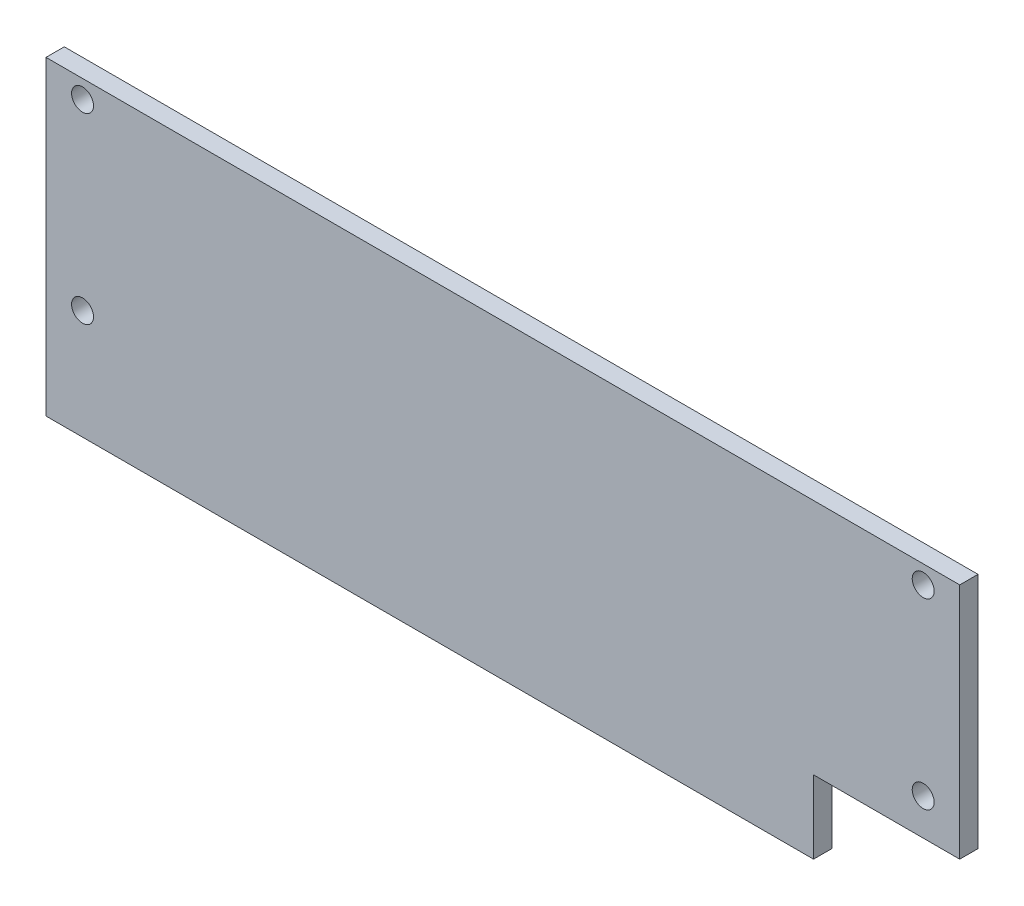
ISO-10303-21;
HEADER;
FILE_DESCRIPTION(('STEP AP214'),'2;1');
FILE_NAME('part.step','',(''),(''),'','','');
FILE_SCHEMA(('AUTOMOTIVE_DESIGN { 1 0 10303 214 1 1 1 1 }'));
ENDSEC;
DATA;
#1=APPLICATION_CONTEXT('core data for automotive mechanical design processes');
#2=APPLICATION_PROTOCOL_DEFINITION('international standard','automotive_design',2000,#1);
#3=PRODUCT_CONTEXT('',#1,'mechanical');
#4=PRODUCT('Part','Part','',(#3));
#5=PRODUCT_RELATED_PRODUCT_CATEGORY('part','',(#4));
#6=PRODUCT_DEFINITION_FORMATION('','',#4);
#7=PRODUCT_DEFINITION_CONTEXT('part definition',#1,'design');
#8=PRODUCT_DEFINITION('design','',#6,#7);
#9=PRODUCT_DEFINITION_SHAPE('','',#8);
#10=(LENGTH_UNIT() NAMED_UNIT(*) SI_UNIT(.MILLI.,.METRE.));
#11=(NAMED_UNIT(*) PLANE_ANGLE_UNIT() SI_UNIT($,.RADIAN.));
#12=(NAMED_UNIT(*) SI_UNIT($,.STERADIAN.) SOLID_ANGLE_UNIT());
#13=UNCERTAINTY_MEASURE_WITH_UNIT(LENGTH_MEASURE(1.E-05),#10,'distance_accuracy_value','');
#14=(GEOMETRIC_REPRESENTATION_CONTEXT(3) GLOBAL_UNCERTAINTY_ASSIGNED_CONTEXT((#13)) GLOBAL_UNIT_ASSIGNED_CONTEXT((#10,
#11,#12)) REPRESENTATION_CONTEXT('',''));
#15=CARTESIAN_POINT('',(0.,0.,0.));
#16=DIRECTION('',(0.,0.,1.));
#17=DIRECTION('',(1.,0.,0.));
#18=AXIS2_PLACEMENT_3D('',#15,#16,#17);
#19=CARTESIAN_POINT('',(0.,0.,5.));
#20=DIRECTION('',(0.,0.,1.));
#21=DIRECTION('',(1.,0.,0.));
#22=AXIS2_PLACEMENT_3D('',#19,#20,#21);
#23=PLANE('',#22);
#24=DIRECTION('',(-1.,0.,0.));
#25=VECTOR('',#24,1.);
#26=CARTESIAN_POINT('',(0.,-65.,5.));
#27=LINE('',#26,#25);
#28=CARTESIAN_POINT('',(250.,-65.,5.));
#29=VERTEX_POINT('',#28);
#30=CARTESIAN_POINT('',(210.,-65.,5.));
#31=VERTEX_POINT('',#30);
#32=EDGE_CURVE('E143',#29,#31,#27,.T.);
#33=ORIENTED_EDGE('',*,*,#32,.F.);
#34=DIRECTION('',(0.,1.,0.));
#35=VECTOR('',#34,1.);
#36=CARTESIAN_POINT('',(250.,0.,5.));
#37=LINE('',#36,#35);
#38=CARTESIAN_POINT('',(250.,0.,5.));
#39=VERTEX_POINT('',#38);
#40=EDGE_CURVE('E135',#29,#39,#37,.T.);
#41=ORIENTED_EDGE('',*,*,#40,.T.);
#42=DIRECTION('',(-1.,0.,0.));
#43=VECTOR('',#42,1.);
#44=CARTESIAN_POINT('',(0.,0.,5.));
#45=LINE('',#44,#43);
#46=CARTESIAN_POINT('',(0.,0.,5.));
#47=VERTEX_POINT('',#46);
#48=EDGE_CURVE('E56',#39,#47,#45,.T.);
#49=ORIENTED_EDGE('',*,*,#48,.T.);
#50=DIRECTION('',(0.,-1.,0.));
#51=VECTOR('',#50,1.);
#52=CARTESIAN_POINT('',(0.,0.,5.));
#53=LINE('',#52,#51);
#54=CARTESIAN_POINT('',(0.,-85.,5.));
#55=VERTEX_POINT('',#54);
#56=EDGE_CURVE('E124',#47,#55,#53,.T.);
#57=ORIENTED_EDGE('',*,*,#56,.T.);
#58=DIRECTION('',(1.,0.,0.));
#59=VECTOR('',#58,1.);
#60=CARTESIAN_POINT('',(0.,-85.,5.));
#61=LINE('',#60,#59);
#62=CARTESIAN_POINT('',(210.,-85.,5.));
#63=VERTEX_POINT('',#62);
#64=EDGE_CURVE('E80',#55,#63,#61,.T.);
#65=ORIENTED_EDGE('',*,*,#64,.T.);
#66=DIRECTION('',(0.,-1.,0.));
#67=VECTOR('',#66,1.);
#68=CARTESIAN_POINT('',(210.,0.,5.));
#69=LINE('',#68,#67);
#70=EDGE_CURVE('E101',#31,#63,#69,.T.);
#71=ORIENTED_EDGE('',*,*,#70,.F.);
#72=EDGE_LOOP('',(#33,#41,#49,#57,#65,#71));
#73=FACE_BOUND('',#72,.T.);
#74=CARTESIAN_POINT('',(240.,-55.,5.));
#75=DIRECTION('',(0.,0.,1.));
#76=DIRECTION('',(-1.,0.,0.));
#77=AXIS2_PLACEMENT_3D('',#74,#75,#76);
#78=CIRCLE('',#77,2.99999999999999);
#79=CARTESIAN_POINT('',(237.,-55.,5.));
#80=VERTEX_POINT('',#79);
#81=EDGE_CURVE('E157',#80,#80,#78,.T.);
#82=ORIENTED_EDGE('',*,*,#81,.F.);
#83=EDGE_LOOP('',(#82));
#84=FACE_BOUND('',#83,.T.);
#85=CARTESIAN_POINT('',(10.,-5.,5.));
#86=DIRECTION('',(0.,0.,1.));
#87=DIRECTION('',(1.,0.,0.));
#88=AXIS2_PLACEMENT_3D('',#85,#86,#87);
#89=CIRCLE('',#88,3.);
#90=CARTESIAN_POINT('',(13.,-5.,5.));
#91=VERTEX_POINT('',#90);
#92=EDGE_CURVE('E119',#91,#91,#89,.T.);
#93=ORIENTED_EDGE('',*,*,#92,.F.);
#94=EDGE_LOOP('',(#93));
#95=FACE_BOUND('',#94,.T.);
#96=CARTESIAN_POINT('',(10.,-55.,5.));
#97=DIRECTION('',(0.,0.,1.));
#98=DIRECTION('',(1.,0.,0.));
#99=AXIS2_PLACEMENT_3D('',#96,#97,#98);
#100=CIRCLE('',#99,3.);
#101=CARTESIAN_POINT('',(13.,-55.,5.));
#102=VERTEX_POINT('',#101);
#103=EDGE_CURVE('E163',#102,#102,#100,.T.);
#104=ORIENTED_EDGE('',*,*,#103,.F.);
#105=EDGE_LOOP('',(#104));
#106=FACE_BOUND('',#105,.T.);
#107=CARTESIAN_POINT('',(240.,-5.,5.));
#108=DIRECTION('',(0.,0.,1.));
#109=DIRECTION('',(-1.,0.,0.));
#110=AXIS2_PLACEMENT_3D('',#107,#108,#109);
#111=CIRCLE('',#110,3.00000000000002);
#112=CARTESIAN_POINT('',(237.,-5.,5.));
#113=VERTEX_POINT('',#112);
#114=EDGE_CURVE('E151',#113,#113,#111,.T.);
#115=ORIENTED_EDGE('',*,*,#114,.F.);
#116=EDGE_LOOP('',(#115));
#117=FACE_BOUND('',#116,.T.);
#118=ADVANCED_FACE('F33',(#73,#84,#95,#106,#117),#23,.T.);
#119=CARTESIAN_POINT('',(0.,0.,0.));
#120=DIRECTION('',(0.,0.,1.));
#121=DIRECTION('',(1.,0.,0.));
#122=AXIS2_PLACEMENT_3D('',#119,#120,#121);
#123=PLANE('',#122);
#124=DIRECTION('',(0.,1.,0.));
#125=VECTOR('',#124,1.);
#126=CARTESIAN_POINT('',(250.,0.,0.));
#127=LINE('',#126,#125);
#128=CARTESIAN_POINT('',(250.,-65.,0.));
#129=VERTEX_POINT('',#128);
#130=CARTESIAN_POINT('',(250.,0.,0.));
#131=VERTEX_POINT('',#130);
#132=EDGE_CURVE('E115',#129,#131,#127,.T.);
#133=ORIENTED_EDGE('',*,*,#132,.F.);
#134=DIRECTION('',(1.,0.,0.));
#135=VECTOR('',#134,1.);
#136=CARTESIAN_POINT('',(210.,-65.,0.));
#137=LINE('',#136,#135);
#138=CARTESIAN_POINT('',(210.,-65.,0.));
#139=VERTEX_POINT('',#138);
#140=EDGE_CURVE('E48',#139,#129,#137,.T.);
#141=ORIENTED_EDGE('',*,*,#140,.F.);
#142=DIRECTION('',(0.,1.,0.));
#143=VECTOR('',#142,1.);
#144=CARTESIAN_POINT('',(210.,-85.,0.));
#145=LINE('',#144,#143);
#146=CARTESIAN_POINT('',(210.,-85.,0.));
#147=VERTEX_POINT('',#146);
#148=EDGE_CURVE('E99',#147,#139,#145,.T.);
#149=ORIENTED_EDGE('',*,*,#148,.F.);
#150=DIRECTION('',(1.,0.,0.));
#151=VECTOR('',#150,1.);
#152=CARTESIAN_POINT('',(0.,-85.,0.));
#153=LINE('',#152,#151);
#154=CARTESIAN_POINT('',(0.,-85.,0.));
#155=VERTEX_POINT('',#154);
#156=EDGE_CURVE('E110',#155,#147,#153,.T.);
#157=ORIENTED_EDGE('',*,*,#156,.F.);
#158=DIRECTION('',(0.,-1.,0.));
#159=VECTOR('',#158,1.);
#160=CARTESIAN_POINT('',(0.,0.,0.));
#161=LINE('',#160,#159);
#162=CARTESIAN_POINT('',(0.,0.,0.));
#163=VERTEX_POINT('',#162);
#164=EDGE_CURVE('E116',#163,#155,#161,.T.);
#165=ORIENTED_EDGE('',*,*,#164,.F.);
#166=DIRECTION('',(-1.,0.,0.));
#167=VECTOR('',#166,1.);
#168=CARTESIAN_POINT('',(0.,0.,0.));
#169=LINE('',#168,#167);
#170=EDGE_CURVE('E73',#131,#163,#169,.T.);
#171=ORIENTED_EDGE('',*,*,#170,.F.);
#172=EDGE_LOOP('',(#133,#141,#149,#157,#165,#171));
#173=FACE_BOUND('',#172,.T.);
#174=CARTESIAN_POINT('',(10.,-5.,0.));
#175=DIRECTION('',(0.,0.,1.));
#176=DIRECTION('',(1.,0.,0.));
#177=AXIS2_PLACEMENT_3D('',#174,#175,#176);
#178=CIRCLE('',#177,3.);
#179=CARTESIAN_POINT('',(13.,-5.,0.));
#180=VERTEX_POINT('',#179);
#181=EDGE_CURVE('E138',#180,#180,#178,.T.);
#182=ORIENTED_EDGE('',*,*,#181,.T.);
#183=EDGE_LOOP('',(#182));
#184=FACE_BOUND('',#183,.T.);
#185=CARTESIAN_POINT('',(10.,-55.,0.));
#186=DIRECTION('',(0.,0.,1.));
#187=DIRECTION('',(1.,0.,0.));
#188=AXIS2_PLACEMENT_3D('',#185,#186,#187);
#189=CIRCLE('',#188,3.);
#190=CARTESIAN_POINT('',(13.,-55.,0.));
#191=VERTEX_POINT('',#190);
#192=EDGE_CURVE('E160',#191,#191,#189,.T.);
#193=ORIENTED_EDGE('',*,*,#192,.T.);
#194=EDGE_LOOP('',(#193));
#195=FACE_BOUND('',#194,.T.);
#196=CARTESIAN_POINT('',(240.,-55.,0.));
#197=DIRECTION('',(0.,0.,1.));
#198=DIRECTION('',(-1.,0.,0.));
#199=AXIS2_PLACEMENT_3D('',#196,#197,#198);
#200=CIRCLE('',#199,2.99999999999999);
#201=CARTESIAN_POINT('',(237.,-55.,0.));
#202=VERTEX_POINT('',#201);
#203=EDGE_CURVE('E155',#202,#202,#200,.T.);
#204=ORIENTED_EDGE('',*,*,#203,.T.);
#205=EDGE_LOOP('',(#204));
#206=FACE_BOUND('',#205,.T.);
#207=CARTESIAN_POINT('',(240.,-5.,0.));
#208=DIRECTION('',(0.,0.,1.));
#209=DIRECTION('',(-1.,0.,0.));
#210=AXIS2_PLACEMENT_3D('',#207,#208,#209);
#211=CIRCLE('',#210,3.00000000000002);
#212=CARTESIAN_POINT('',(237.,-5.,0.));
#213=VERTEX_POINT('',#212);
#214=EDGE_CURVE('E148',#213,#213,#211,.T.);
#215=ORIENTED_EDGE('',*,*,#214,.T.);
#216=EDGE_LOOP('',(#215));
#217=FACE_BOUND('',#216,.T.);
#218=ADVANCED_FACE('F107',(#173,#184,#195,#206,#217),#123,.F.);
#219=CARTESIAN_POINT('',(0.,0.,5.));
#220=DIRECTION('',(1.,0.,0.));
#221=DIRECTION('',(0.,1.,0.));
#222=AXIS2_PLACEMENT_3D('',#219,#220,#221);
#223=PLANE('',#222);
#224=ORIENTED_EDGE('',*,*,#164,.T.);
#225=DIRECTION('',(0.,0.,-1.));
#226=VECTOR('',#225,1.);
#227=CARTESIAN_POINT('',(0.,-85.,5.));
#228=LINE('',#227,#226);
#229=EDGE_CURVE('E41',#55,#155,#228,.T.);
#230=ORIENTED_EDGE('',*,*,#229,.F.);
#231=ORIENTED_EDGE('',*,*,#56,.F.);
#232=DIRECTION('',(0.,0.,-1.));
#233=VECTOR('',#232,1.);
#234=CARTESIAN_POINT('',(0.,0.,5.));
#235=LINE('',#234,#233);
#236=EDGE_CURVE('E125',#47,#163,#235,.T.);
#237=ORIENTED_EDGE('',*,*,#236,.T.);
#238=EDGE_LOOP('',(#224,#230,#231,#237));
#239=FACE_BOUND('',#238,.T.);
#240=ADVANCED_FACE('F35',(#239),#223,.F.);
#241=CARTESIAN_POINT('',(0.,-85.,5.));
#242=DIRECTION('',(0.,1.,0.));
#243=DIRECTION('',(-1.,0.,0.));
#244=AXIS2_PLACEMENT_3D('',#241,#242,#243);
#245=PLANE('',#244);
#246=ORIENTED_EDGE('',*,*,#156,.T.);
#247=DIRECTION('',(0.,0.,-1.));
#248=VECTOR('',#247,1.);
#249=CARTESIAN_POINT('',(210.,-85.,10.));
#250=LINE('',#249,#248);
#251=EDGE_CURVE('E95',#63,#147,#250,.T.);
#252=ORIENTED_EDGE('',*,*,#251,.F.);
#253=ORIENTED_EDGE('',*,*,#64,.F.);
#254=ORIENTED_EDGE('',*,*,#229,.T.);
#255=EDGE_LOOP('',(#246,#252,#253,#254));
#256=FACE_BOUND('',#255,.T.);
#257=ADVANCED_FACE('F112',(#256),#245,.F.);
#258=CARTESIAN_POINT('',(250.,0.,5.));
#259=DIRECTION('',(-1.,0.,0.));
#260=DIRECTION('',(0.,0.,1.));
#261=AXIS2_PLACEMENT_3D('',#258,#259,#260);
#262=PLANE('',#261);
#263=ORIENTED_EDGE('',*,*,#40,.F.);
#264=DIRECTION('',(0.,0.,-1.));
#265=VECTOR('',#264,1.);
#266=CARTESIAN_POINT('',(250.,-65.,5.));
#267=LINE('',#266,#265);
#268=EDGE_CURVE('E11',#29,#129,#267,.T.);
#269=ORIENTED_EDGE('',*,*,#268,.T.);
#270=ORIENTED_EDGE('',*,*,#132,.T.);
#271=DIRECTION('',(0.,0.,-1.));
#272=VECTOR('',#271,1.);
#273=CARTESIAN_POINT('',(250.,0.,5.));
#274=LINE('',#273,#272);
#275=EDGE_CURVE('E127',#39,#131,#274,.T.);
#276=ORIENTED_EDGE('',*,*,#275,.F.);
#277=EDGE_LOOP('',(#263,#269,#270,#276));
#278=FACE_BOUND('',#277,.T.);
#279=ADVANCED_FACE('F144',(#278),#262,.F.);
#280=CARTESIAN_POINT('',(0.,0.,5.));
#281=DIRECTION('',(0.,-1.,0.));
#282=DIRECTION('',(0.,0.,-1.));
#283=AXIS2_PLACEMENT_3D('',#280,#281,#282);
#284=PLANE('',#283);
#285=ORIENTED_EDGE('',*,*,#170,.T.);
#286=ORIENTED_EDGE('',*,*,#236,.F.);
#287=ORIENTED_EDGE('',*,*,#48,.F.);
#288=ORIENTED_EDGE('',*,*,#275,.T.);
#289=EDGE_LOOP('',(#285,#286,#287,#288));
#290=FACE_BOUND('',#289,.T.);
#291=ADVANCED_FACE('F129',(#290),#284,.F.);
#292=CARTESIAN_POINT('',(10.,-5.,5.));
#293=DIRECTION('',(0.,0.,-1.));
#294=DIRECTION('',(-1.,0.,0.));
#295=AXIS2_PLACEMENT_3D('',#292,#293,#294);
#296=CYLINDRICAL_SURFACE('',#295,3.);
#297=ORIENTED_EDGE('',*,*,#92,.T.);
#298=EDGE_LOOP('',(#297));
#299=FACE_BOUND('',#298,.T.);
#300=ORIENTED_EDGE('',*,*,#181,.F.);
#301=EDGE_LOOP('',(#300));
#302=FACE_BOUND('',#301,.T.);
#303=ADVANCED_FACE('F174',(#299,#302),#296,.F.);
#304=CARTESIAN_POINT('',(10.,-55.,5.));
#305=DIRECTION('',(0.,0.,-1.));
#306=DIRECTION('',(-1.,0.,0.));
#307=AXIS2_PLACEMENT_3D('',#304,#305,#306);
#308=CYLINDRICAL_SURFACE('',#307,3.);
#309=ORIENTED_EDGE('',*,*,#103,.T.);
#310=EDGE_LOOP('',(#309));
#311=FACE_BOUND('',#310,.T.);
#312=ORIENTED_EDGE('',*,*,#192,.F.);
#313=EDGE_LOOP('',(#312));
#314=FACE_BOUND('',#313,.T.);
#315=ADVANCED_FACE('F176',(#311,#314),#308,.F.);
#316=CARTESIAN_POINT('',(240.,-55.,5.));
#317=DIRECTION('',(0.,0.,-1.));
#318=DIRECTION('',(-1.,0.,0.));
#319=AXIS2_PLACEMENT_3D('',#316,#317,#318);
#320=CYLINDRICAL_SURFACE('',#319,2.99999999999999);
#321=ORIENTED_EDGE('',*,*,#81,.T.);
#322=EDGE_LOOP('',(#321));
#323=FACE_BOUND('',#322,.T.);
#324=ORIENTED_EDGE('',*,*,#203,.F.);
#325=EDGE_LOOP('',(#324));
#326=FACE_BOUND('',#325,.T.);
#327=ADVANCED_FACE('F182',(#323,#326),#320,.F.);
#328=CARTESIAN_POINT('',(240.,-5.,5.));
#329=DIRECTION('',(0.,0.,-1.));
#330=DIRECTION('',(-1.,0.,0.));
#331=AXIS2_PLACEMENT_3D('',#328,#329,#330);
#332=CYLINDRICAL_SURFACE('',#331,3.00000000000002);
#333=ORIENTED_EDGE('',*,*,#114,.T.);
#334=EDGE_LOOP('',(#333));
#335=FACE_BOUND('',#334,.T.);
#336=ORIENTED_EDGE('',*,*,#214,.F.);
#337=EDGE_LOOP('',(#336));
#338=FACE_BOUND('',#337,.T.);
#339=ADVANCED_FACE('F228',(#335,#338),#332,.F.);
#340=CARTESIAN_POINT('',(210.,-65.,10.));
#341=DIRECTION('',(0.,1.,0.));
#342=DIRECTION('',(0.,0.,1.));
#343=AXIS2_PLACEMENT_3D('',#340,#341,#342);
#344=PLANE('',#343);
#345=ORIENTED_EDGE('',*,*,#32,.T.);
#346=DIRECTION('',(0.,0.,-1.));
#347=VECTOR('',#346,1.);
#348=CARTESIAN_POINT('',(210.,-65.,10.));
#349=LINE('',#348,#347);
#350=EDGE_CURVE('E103',#31,#139,#349,.T.);
#351=ORIENTED_EDGE('',*,*,#350,.T.);
#352=ORIENTED_EDGE('',*,*,#140,.T.);
#353=ORIENTED_EDGE('',*,*,#268,.F.);
#354=EDGE_LOOP('',(#345,#351,#352,#353));
#355=FACE_BOUND('',#354,.T.);
#356=ADVANCED_FACE('F145',(#355),#344,.F.);
#357=CARTESIAN_POINT('',(210.,-85.,10.));
#358=DIRECTION('',(-1.,0.,0.));
#359=DIRECTION('',(0.,0.,1.));
#360=AXIS2_PLACEMENT_3D('',#357,#358,#359);
#361=PLANE('',#360);
#362=ORIENTED_EDGE('',*,*,#70,.T.);
#363=ORIENTED_EDGE('',*,*,#251,.T.);
#364=ORIENTED_EDGE('',*,*,#148,.T.);
#365=ORIENTED_EDGE('',*,*,#350,.F.);
#366=EDGE_LOOP('',(#362,#363,#364,#365));
#367=FACE_BOUND('',#366,.T.);
#368=ADVANCED_FACE('F97',(#367),#361,.F.);
#369=CLOSED_SHELL('',(#118,#218,#240,#257,#279,#291,#303,#315,#327,#339,#356,#368));
#370=MANIFOLD_SOLID_BREP('B2',#369);
#371=ADVANCED_BREP_SHAPE_REPRESENTATION('',(#18,#370),#14);
#372=SHAPE_DEFINITION_REPRESENTATION(#9,#371);
ENDSEC;
END-ISO-10303-21;
